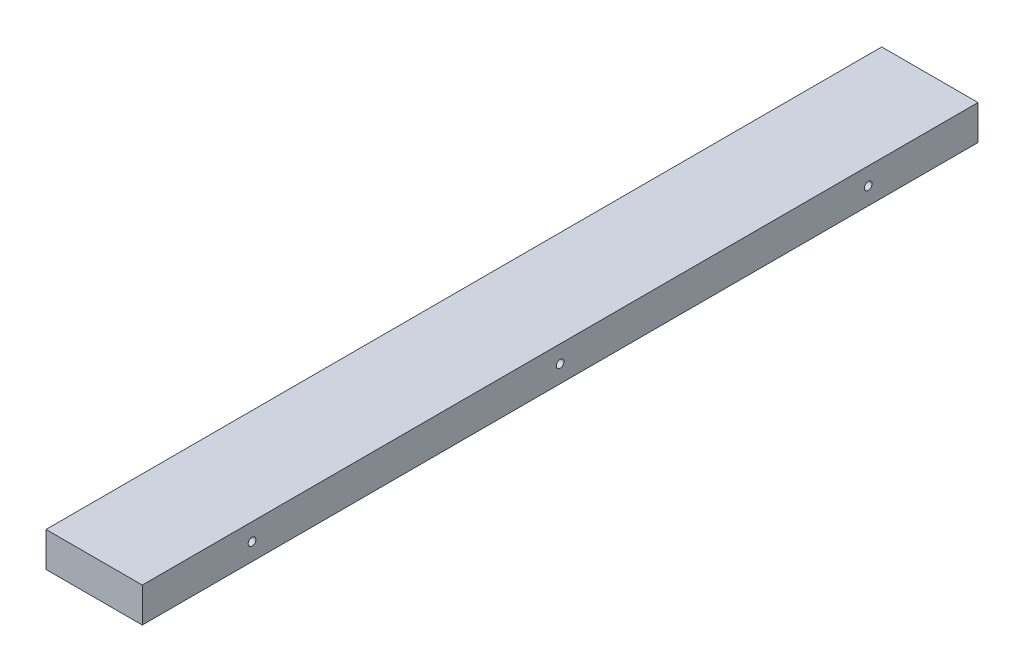
ISO-10303-21;
HEADER;
FILE_DESCRIPTION(('STEP AP214'),'2;1');
FILE_NAME('part.step','',(''),(''),'','','');
FILE_SCHEMA(('AUTOMOTIVE_DESIGN { 1 0 10303 214 1 1 1 1 }'));
ENDSEC;
DATA;
#1=APPLICATION_CONTEXT('core data for automotive mechanical design processes');
#2=APPLICATION_PROTOCOL_DEFINITION('international standard','automotive_design',2000,#1);
#3=PRODUCT_CONTEXT('',#1,'mechanical');
#4=PRODUCT('Part','Part','',(#3));
#5=PRODUCT_RELATED_PRODUCT_CATEGORY('part','',(#4));
#6=PRODUCT_DEFINITION_FORMATION('','',#4);
#7=PRODUCT_DEFINITION_CONTEXT('part definition',#1,'design');
#8=PRODUCT_DEFINITION('design','',#6,#7);
#9=PRODUCT_DEFINITION_SHAPE('','',#8);
#10=(LENGTH_UNIT() NAMED_UNIT(*) SI_UNIT(.MILLI.,.METRE.));
#11=(NAMED_UNIT(*) PLANE_ANGLE_UNIT() SI_UNIT($,.RADIAN.));
#12=(NAMED_UNIT(*) SI_UNIT($,.STERADIAN.) SOLID_ANGLE_UNIT());
#13=UNCERTAINTY_MEASURE_WITH_UNIT(LENGTH_MEASURE(1.E-05),#10,'distance_accuracy_value','');
#14=(GEOMETRIC_REPRESENTATION_CONTEXT(3) GLOBAL_UNCERTAINTY_ASSIGNED_CONTEXT((#13)) GLOBAL_UNIT_ASSIGNED_CONTEXT((#10,
#11,#12)) REPRESENTATION_CONTEXT('',''));
#15=CARTESIAN_POINT('',(0.,0.,0.));
#16=DIRECTION('',(0.,0.,1.));
#17=DIRECTION('',(1.,0.,0.));
#18=AXIS2_PLACEMENT_3D('',#15,#16,#17);
#19=CARTESIAN_POINT('',(25.,18.,-217.));
#20=DIRECTION('',(-1.,0.,0.));
#21=DIRECTION('',(0.,0.,1.));
#22=AXIS2_PLACEMENT_3D('',#19,#20,#21);
#23=PLANE('',#22);
#24=CARTESIAN_POINT('',(25.,9.00000000000002,-160.));
#25=DIRECTION('',(1.,0.,0.));
#26=DIRECTION('',(0.,0.,-1.));
#27=AXIS2_PLACEMENT_3D('',#24,#25,#26);
#28=CIRCLE('',#27,1.99999999999999);
#29=CARTESIAN_POINT('',(25.,9.00000000000002,-162.));
#30=VERTEX_POINT('',#29);
#31=EDGE_CURVE('E135',#30,#30,#28,.T.);
#32=ORIENTED_EDGE('',*,*,#31,.F.);
#33=EDGE_LOOP('',(#32));
#34=FACE_BOUND('',#33,.T.);
#35=CARTESIAN_POINT('',(25.,9.00000000000004,3.71502623850664E-13));
#36=DIRECTION('',(1.,0.,0.));
#37=DIRECTION('',(0.,0.,-1.));
#38=AXIS2_PLACEMENT_3D('',#35,#36,#37);
#39=CIRCLE('',#38,1.99999999999999);
#40=CARTESIAN_POINT('',(25.,9.00000000000004,-1.99999999999962));
#41=VERTEX_POINT('',#40);
#42=EDGE_CURVE('E141',#41,#41,#39,.T.);
#43=ORIENTED_EDGE('',*,*,#42,.F.);
#44=EDGE_LOOP('',(#43));
#45=FACE_BOUND('',#44,.T.);
#46=CARTESIAN_POINT('',(25.,9.00000000000002,160.));
#47=DIRECTION('',(1.,0.,0.));
#48=DIRECTION('',(0.,0.,-1.));
#49=AXIS2_PLACEMENT_3D('',#46,#47,#48);
#50=CIRCLE('',#49,1.99999999999999);
#51=CARTESIAN_POINT('',(25.,9.00000000000002,158.));
#52=VERTEX_POINT('',#51);
#53=EDGE_CURVE('E147',#52,#52,#50,.T.);
#54=ORIENTED_EDGE('',*,*,#53,.F.);
#55=EDGE_LOOP('',(#54));
#56=FACE_BOUND('',#55,.T.);
#57=DIRECTION('',(0.,0.,-1.));
#58=VECTOR('',#57,1.);
#59=CARTESIAN_POINT('',(25.,0.,-217.));
#60=LINE('',#59,#58);
#61=CARTESIAN_POINT('',(25.,0.,217.));
#62=VERTEX_POINT('',#61);
#63=CARTESIAN_POINT('',(25.,0.,-217.));
#64=VERTEX_POINT('',#63);
#65=EDGE_CURVE('E153',#62,#64,#60,.T.);
#66=ORIENTED_EDGE('',*,*,#65,.T.);
#67=DIRECTION('',(0.,-1.,0.));
#68=VECTOR('',#67,1.);
#69=CARTESIAN_POINT('',(25.,18.,-217.));
#70=LINE('',#69,#68);
#71=CARTESIAN_POINT('',(25.,18.,-217.));
#72=VERTEX_POINT('',#71);
#73=EDGE_CURVE('E11',#72,#64,#70,.T.);
#74=ORIENTED_EDGE('',*,*,#73,.F.);
#75=DIRECTION('',(0.,0.,-1.));
#76=VECTOR('',#75,1.);
#77=CARTESIAN_POINT('',(25.,18.,-217.));
#78=LINE('',#77,#76);
#79=CARTESIAN_POINT('',(25.,18.,217.));
#80=VERTEX_POINT('',#79);
#81=EDGE_CURVE('E154',#80,#72,#78,.T.);
#82=ORIENTED_EDGE('',*,*,#81,.F.);
#83=DIRECTION('',(0.,-1.,0.));
#84=VECTOR('',#83,1.);
#85=CARTESIAN_POINT('',(25.,18.,217.));
#86=LINE('',#85,#84);
#87=EDGE_CURVE('E160',#80,#62,#86,.T.);
#88=ORIENTED_EDGE('',*,*,#87,.T.);
#89=EDGE_LOOP('',(#66,#74,#82,#88));
#90=FACE_BOUND('',#89,.T.);
#91=ADVANCED_FACE('F33',(#34,#45,#56,#90),#23,.F.);
#92=CARTESIAN_POINT('',(-25.,18.,-217.));
#93=DIRECTION('',(0.,0.,1.));
#94=DIRECTION('',(1.,0.,0.));
#95=AXIS2_PLACEMENT_3D('',#92,#93,#94);
#96=PLANE('',#95);
#97=DIRECTION('',(-1.,0.,0.));
#98=VECTOR('',#97,1.);
#99=CARTESIAN_POINT('',(-25.,0.,-217.));
#100=LINE('',#99,#98);
#101=CARTESIAN_POINT('',(-25.,0.,-217.));
#102=VERTEX_POINT('',#101);
#103=EDGE_CURVE('E163',#64,#102,#100,.T.);
#104=ORIENTED_EDGE('',*,*,#103,.T.);
#105=DIRECTION('',(0.,-1.,0.));
#106=VECTOR('',#105,1.);
#107=CARTESIAN_POINT('',(-25.,18.,-217.));
#108=LINE('',#107,#106);
#109=CARTESIAN_POINT('',(-25.,18.,-217.));
#110=VERTEX_POINT('',#109);
#111=EDGE_CURVE('E41',#110,#102,#108,.T.);
#112=ORIENTED_EDGE('',*,*,#111,.F.);
#113=DIRECTION('',(-1.,0.,0.));
#114=VECTOR('',#113,1.);
#115=CARTESIAN_POINT('',(-25.,18.,-217.));
#116=LINE('',#115,#114);
#117=EDGE_CURVE('E80',#72,#110,#116,.T.);
#118=ORIENTED_EDGE('',*,*,#117,.F.);
#119=ORIENTED_EDGE('',*,*,#73,.T.);
#120=EDGE_LOOP('',(#104,#112,#118,#119));
#121=FACE_BOUND('',#120,.T.);
#122=ADVANCED_FACE('F186',(#121),#96,.F.);
#123=CARTESIAN_POINT('',(-25.,18.,-217.));
#124=DIRECTION('',(1.,0.,0.));
#125=DIRECTION('',(0.,0.,-1.));
#126=AXIS2_PLACEMENT_3D('',#123,#124,#125);
#127=PLANE('',#126);
#128=CARTESIAN_POINT('',(-25.,9.,180.));
#129=DIRECTION('',(-1.,0.,0.));
#130=DIRECTION('',(0.,0.,1.));
#131=AXIS2_PLACEMENT_3D('',#128,#129,#130);
#132=CIRCLE('',#131,1.99999999999999);
#133=CARTESIAN_POINT('',(-25.,9.,182.));
#134=VERTEX_POINT('',#133);
#135=EDGE_CURVE('E113',#134,#134,#132,.T.);
#136=ORIENTED_EDGE('',*,*,#135,.F.);
#137=EDGE_LOOP('',(#136));
#138=FACE_BOUND('',#137,.T.);
#139=CARTESIAN_POINT('',(-25.,9.,60.0000000000001));
#140=DIRECTION('',(-1.,0.,0.));
#141=DIRECTION('',(0.,0.,1.));
#142=AXIS2_PLACEMENT_3D('',#139,#140,#141);
#143=CIRCLE('',#142,1.99999999999999);
#144=CARTESIAN_POINT('',(-25.,9.,62.));
#145=VERTEX_POINT('',#144);
#146=EDGE_CURVE('E112',#145,#145,#143,.T.);
#147=ORIENTED_EDGE('',*,*,#146,.F.);
#148=EDGE_LOOP('',(#147));
#149=FACE_BOUND('',#148,.T.);
#150=CARTESIAN_POINT('',(-25.,9.,-59.9999999999999));
#151=DIRECTION('',(-1.,0.,0.));
#152=DIRECTION('',(0.,0.,1.));
#153=AXIS2_PLACEMENT_3D('',#150,#151,#152);
#154=CIRCLE('',#153,1.99999999999999);
#155=CARTESIAN_POINT('',(-25.,9.,-58.));
#156=VERTEX_POINT('',#155);
#157=EDGE_CURVE('E123',#156,#156,#154,.T.);
#158=ORIENTED_EDGE('',*,*,#157,.F.);
#159=EDGE_LOOP('',(#158));
#160=FACE_BOUND('',#159,.T.);
#161=CARTESIAN_POINT('',(-25.,9.,-180.));
#162=DIRECTION('',(-1.,0.,0.));
#163=DIRECTION('',(0.,0.,1.));
#164=AXIS2_PLACEMENT_3D('',#161,#162,#163);
#165=CIRCLE('',#164,1.99999999999999);
#166=CARTESIAN_POINT('',(-25.,9.,-178.));
#167=VERTEX_POINT('',#166);
#168=EDGE_CURVE('E129',#167,#167,#165,.T.);
#169=ORIENTED_EDGE('',*,*,#168,.F.);
#170=EDGE_LOOP('',(#169));
#171=FACE_BOUND('',#170,.T.);
#172=DIRECTION('',(0.,0.,1.));
#173=VECTOR('',#172,1.);
#174=CARTESIAN_POINT('',(-25.,0.,-217.));
#175=LINE('',#174,#173);
#176=CARTESIAN_POINT('',(-25.,0.,217.));
#177=VERTEX_POINT('',#176);
#178=EDGE_CURVE('E67',#102,#177,#175,.T.);
#179=ORIENTED_EDGE('',*,*,#178,.T.);
#180=DIRECTION('',(0.,-1.,0.));
#181=VECTOR('',#180,1.);
#182=CARTESIAN_POINT('',(-25.,18.,217.));
#183=LINE('',#182,#181);
#184=CARTESIAN_POINT('',(-25.,18.,217.));
#185=VERTEX_POINT('',#184);
#186=EDGE_CURVE('E168',#185,#177,#183,.T.);
#187=ORIENTED_EDGE('',*,*,#186,.F.);
#188=DIRECTION('',(0.,0.,1.));
#189=VECTOR('',#188,1.);
#190=CARTESIAN_POINT('',(-25.,18.,-217.));
#191=LINE('',#190,#189);
#192=EDGE_CURVE('E157',#110,#185,#191,.T.);
#193=ORIENTED_EDGE('',*,*,#192,.F.);
#194=ORIENTED_EDGE('',*,*,#111,.T.);
#195=EDGE_LOOP('',(#179,#187,#193,#194));
#196=FACE_BOUND('',#195,.T.);
#197=ADVANCED_FACE('F170',(#138,#149,#160,#171,#196),#127,.F.);
#198=CARTESIAN_POINT('',(-25.,18.,217.));
#199=DIRECTION('',(0.,0.,-1.));
#200=DIRECTION('',(-1.,0.,0.));
#201=AXIS2_PLACEMENT_3D('',#198,#199,#200);
#202=PLANE('',#201);
#203=DIRECTION('',(1.,0.,0.));
#204=VECTOR('',#203,1.);
#205=CARTESIAN_POINT('',(-25.,0.,217.));
#206=LINE('',#205,#204);
#207=EDGE_CURVE('E73',#177,#62,#206,.T.);
#208=ORIENTED_EDGE('',*,*,#207,.T.);
#209=ORIENTED_EDGE('',*,*,#87,.F.);
#210=DIRECTION('',(1.,0.,0.));
#211=VECTOR('',#210,1.);
#212=CARTESIAN_POINT('',(-25.,18.,217.));
#213=LINE('',#212,#211);
#214=EDGE_CURVE('E49',#185,#80,#213,.T.);
#215=ORIENTED_EDGE('',*,*,#214,.F.);
#216=ORIENTED_EDGE('',*,*,#186,.T.);
#217=EDGE_LOOP('',(#208,#209,#215,#216));
#218=FACE_BOUND('',#217,.T.);
#219=ADVANCED_FACE('F177',(#218),#202,.F.);
#220=CARTESIAN_POINT('',(0.,18.,0.));
#221=DIRECTION('',(0.,1.,0.));
#222=DIRECTION('',(0.,0.,1.));
#223=AXIS2_PLACEMENT_3D('',#220,#221,#222);
#224=PLANE('',#223);
#225=ORIENTED_EDGE('',*,*,#81,.T.);
#226=ORIENTED_EDGE('',*,*,#117,.T.);
#227=ORIENTED_EDGE('',*,*,#192,.T.);
#228=ORIENTED_EDGE('',*,*,#214,.T.);
#229=EDGE_LOOP('',(#225,#226,#227,#228));
#230=FACE_BOUND('',#229,.T.);
#231=ADVANCED_FACE('F179',(#230),#224,.T.);
#232=CARTESIAN_POINT('',(0.,0.,0.));
#233=DIRECTION('',(0.,1.,0.));
#234=DIRECTION('',(0.,0.,1.));
#235=AXIS2_PLACEMENT_3D('',#232,#233,#234);
#236=PLANE('',#235);
#237=ORIENTED_EDGE('',*,*,#65,.F.);
#238=ORIENTED_EDGE('',*,*,#207,.F.);
#239=ORIENTED_EDGE('',*,*,#178,.F.);
#240=ORIENTED_EDGE('',*,*,#103,.F.);
#241=EDGE_LOOP('',(#237,#238,#239,#240));
#242=FACE_BOUND('',#241,.T.);
#243=ADVANCED_FACE('F173',(#242),#236,.F.);
#244=CARTESIAN_POINT('',(-4.99999999999998,9.00000000000002,160.));
#245=DIRECTION('',(1.,0.,0.));
#246=DIRECTION('',(0.,0.,-1.));
#247=AXIS2_PLACEMENT_3D('',#244,#245,#246);
#248=CONICAL_SURFACE('',#247,1.99999999999998,1.02974425867665);
#249=CARTESIAN_POINT('',(-6.2017212380551,9.00000000000001,160.));
#250=VERTEX_POINT('',#249);
#251=VERTEX_LOOP('',#250);
#252=FACE_BOUND('',#251,.T.);
#253=CARTESIAN_POINT('',(-4.99999999999998,9.00000000000002,160.));
#254=DIRECTION('',(1.,0.,0.));
#255=DIRECTION('',(0.,0.,-1.));
#256=AXIS2_PLACEMENT_3D('',#253,#254,#255);
#257=CIRCLE('',#256,1.99999999999998);
#258=CARTESIAN_POINT('',(-4.99999999999998,9.00000000000002,158.));
#259=VERTEX_POINT('',#258);
#260=EDGE_CURVE('E150',#259,#259,#257,.T.);
#261=ORIENTED_EDGE('',*,*,#260,.T.);
#262=EDGE_LOOP('',(#261));
#263=FACE_BOUND('',#262,.T.);
#264=ADVANCED_FACE('F204',(#252,#263),#248,.F.);
#265=CARTESIAN_POINT('',(25.,9.00000000000002,160.));
#266=DIRECTION('',(1.,0.,0.));
#267=DIRECTION('',(0.,0.,-1.));
#268=AXIS2_PLACEMENT_3D('',#265,#266,#267);
#269=CYLINDRICAL_SURFACE('',#268,1.99999999999999);
#270=ORIENTED_EDGE('',*,*,#260,.F.);
#271=EDGE_LOOP('',(#270));
#272=FACE_BOUND('',#271,.T.);
#273=ORIENTED_EDGE('',*,*,#53,.T.);
#274=EDGE_LOOP('',(#273));
#275=FACE_BOUND('',#274,.T.);
#276=ADVANCED_FACE('F201',(#272,#275),#269,.F.);
#277=CARTESIAN_POINT('',(-5.,9.00000000000004,3.75339800203056E-13));
#278=DIRECTION('',(1.,0.,0.));
#279=DIRECTION('',(0.,0.,-1.));
#280=AXIS2_PLACEMENT_3D('',#277,#278,#279);
#281=CONICAL_SURFACE('',#280,1.99999999999998,1.02974425867665);
#282=CARTESIAN_POINT('',(-6.20172123805512,9.00000000000003,3.75493507413617E-13));
#283=VERTEX_POINT('',#282);
#284=VERTEX_LOOP('',#283);
#285=FACE_BOUND('',#284,.T.);
#286=CARTESIAN_POINT('',(-5.,9.00000000000004,3.75339800203056E-13));
#287=DIRECTION('',(1.,0.,0.));
#288=DIRECTION('',(0.,0.,-1.));
#289=AXIS2_PLACEMENT_3D('',#286,#287,#288);
#290=CIRCLE('',#289,1.99999999999998);
#291=CARTESIAN_POINT('',(-5.,9.00000000000004,-1.99999999999961));
#292=VERTEX_POINT('',#291);
#293=EDGE_CURVE('E144',#292,#292,#290,.T.);
#294=ORIENTED_EDGE('',*,*,#293,.T.);
#295=EDGE_LOOP('',(#294));
#296=FACE_BOUND('',#295,.T.);
#297=ADVANCED_FACE('F203',(#285,#296),#281,.F.);
#298=CARTESIAN_POINT('',(25.,9.00000000000004,3.71502623850664E-13));
#299=DIRECTION('',(1.,0.,0.));
#300=DIRECTION('',(0.,0.,-1.));
#301=AXIS2_PLACEMENT_3D('',#298,#299,#300);
#302=CYLINDRICAL_SURFACE('',#301,1.99999999999999);
#303=ORIENTED_EDGE('',*,*,#293,.F.);
#304=EDGE_LOOP('',(#303));
#305=FACE_BOUND('',#304,.T.);
#306=ORIENTED_EDGE('',*,*,#42,.T.);
#307=EDGE_LOOP('',(#306));
#308=FACE_BOUND('',#307,.T.);
#309=ADVANCED_FACE('F211',(#305,#308),#302,.F.);
#310=CARTESIAN_POINT('',(-5.00000000000002,9.00000000000002,-160.));
#311=DIRECTION('',(1.,0.,0.));
#312=DIRECTION('',(0.,0.,-1.));
#313=AXIS2_PLACEMENT_3D('',#310,#311,#312);
#314=CONICAL_SURFACE('',#313,1.99999999999998,1.02974425867665);
#315=CARTESIAN_POINT('',(-6.20172123805514,9.00000000000001,-160.));
#316=VERTEX_POINT('',#315);
#317=VERTEX_LOOP('',#316);
#318=FACE_BOUND('',#317,.T.);
#319=CARTESIAN_POINT('',(-5.00000000000002,9.00000000000002,-160.));
#320=DIRECTION('',(1.,0.,0.));
#321=DIRECTION('',(0.,0.,-1.));
#322=AXIS2_PLACEMENT_3D('',#319,#320,#321);
#323=CIRCLE('',#322,1.99999999999998);
#324=CARTESIAN_POINT('',(-5.00000000000002,9.00000000000002,-162.));
#325=VERTEX_POINT('',#324);
#326=EDGE_CURVE('E138',#325,#325,#323,.T.);
#327=ORIENTED_EDGE('',*,*,#326,.T.);
#328=EDGE_LOOP('',(#327));
#329=FACE_BOUND('',#328,.T.);
#330=ADVANCED_FACE('F248',(#318,#329),#314,.F.);
#331=CARTESIAN_POINT('',(25.,9.00000000000002,-160.));
#332=DIRECTION('',(1.,0.,0.));
#333=DIRECTION('',(0.,0.,-1.));
#334=AXIS2_PLACEMENT_3D('',#331,#332,#333);
#335=CYLINDRICAL_SURFACE('',#334,1.99999999999999);
#336=ORIENTED_EDGE('',*,*,#326,.F.);
#337=EDGE_LOOP('',(#336));
#338=FACE_BOUND('',#337,.T.);
#339=ORIENTED_EDGE('',*,*,#31,.T.);
#340=EDGE_LOOP('',(#339));
#341=FACE_BOUND('',#340,.T.);
#342=ADVANCED_FACE('F257',(#338,#341),#335,.F.);
#343=CARTESIAN_POINT('',(4.99999999999997,9.,-180.));
#344=DIRECTION('',(-1.,0.,0.));
#345=DIRECTION('',(0.,0.,1.));
#346=AXIS2_PLACEMENT_3D('',#343,#344,#345);
#347=CONICAL_SURFACE('',#346,1.99999999999999,1.02974425867665);
#348=CARTESIAN_POINT('',(6.2017212380551,9.,-180.));
#349=VERTEX_POINT('',#348);
#350=VERTEX_LOOP('',#349);
#351=FACE_BOUND('',#350,.T.);
#352=CARTESIAN_POINT('',(4.99999999999997,9.,-180.));
#353=DIRECTION('',(-1.,0.,0.));
#354=DIRECTION('',(0.,0.,1.));
#355=AXIS2_PLACEMENT_3D('',#352,#353,#354);
#356=CIRCLE('',#355,1.99999999999999);
#357=CARTESIAN_POINT('',(4.99999999999997,9.,-178.));
#358=VERTEX_POINT('',#357);
#359=EDGE_CURVE('E132',#358,#358,#356,.T.);
#360=ORIENTED_EDGE('',*,*,#359,.T.);
#361=EDGE_LOOP('',(#360));
#362=FACE_BOUND('',#361,.T.);
#363=ADVANCED_FACE('F267',(#351,#362),#347,.F.);
#364=CARTESIAN_POINT('',(-25.,9.,-180.));
#365=DIRECTION('',(-1.,0.,0.));
#366=DIRECTION('',(0.,0.,1.));
#367=AXIS2_PLACEMENT_3D('',#364,#365,#366);
#368=CYLINDRICAL_SURFACE('',#367,1.99999999999999);
#369=ORIENTED_EDGE('',*,*,#359,.F.);
#370=EDGE_LOOP('',(#369));
#371=FACE_BOUND('',#370,.T.);
#372=ORIENTED_EDGE('',*,*,#168,.T.);
#373=EDGE_LOOP('',(#372));
#374=FACE_BOUND('',#373,.T.);
#375=ADVANCED_FACE('F285',(#371,#374),#368,.F.);
#376=CARTESIAN_POINT('',(4.99999999999999,9.,-60.));
#377=DIRECTION('',(-1.,0.,0.));
#378=DIRECTION('',(0.,0.,1.));
#379=AXIS2_PLACEMENT_3D('',#376,#377,#378);
#380=CONICAL_SURFACE('',#379,1.99999999999999,1.02974425867665);
#381=CARTESIAN_POINT('',(6.20172123805511,9.,-60.));
#382=VERTEX_POINT('',#381);
#383=VERTEX_LOOP('',#382);
#384=FACE_BOUND('',#383,.T.);
#385=CARTESIAN_POINT('',(4.99999999999999,9.,-60.));
#386=DIRECTION('',(-1.,0.,0.));
#387=DIRECTION('',(0.,0.,1.));
#388=AXIS2_PLACEMENT_3D('',#385,#386,#387);
#389=CIRCLE('',#388,1.99999999999999);
#390=CARTESIAN_POINT('',(4.99999999999999,9.,-58.));
#391=VERTEX_POINT('',#390);
#392=EDGE_CURVE('E126',#391,#391,#389,.T.);
#393=ORIENTED_EDGE('',*,*,#392,.T.);
#394=EDGE_LOOP('',(#393));
#395=FACE_BOUND('',#394,.T.);
#396=ADVANCED_FACE('F295',(#384,#395),#380,.F.);
#397=CARTESIAN_POINT('',(-25.,9.,-59.9999999999999));
#398=DIRECTION('',(-1.,0.,0.));
#399=DIRECTION('',(0.,0.,1.));
#400=AXIS2_PLACEMENT_3D('',#397,#398,#399);
#401=CYLINDRICAL_SURFACE('',#400,1.99999999999999);
#402=ORIENTED_EDGE('',*,*,#392,.F.);
#403=EDGE_LOOP('',(#402));
#404=FACE_BOUND('',#403,.T.);
#405=ORIENTED_EDGE('',*,*,#157,.T.);
#406=EDGE_LOOP('',(#405));
#407=FACE_BOUND('',#406,.T.);
#408=ADVANCED_FACE('F305',(#404,#407),#401,.F.);
#409=CARTESIAN_POINT('',(5.,9.,60.));
#410=DIRECTION('',(-1.,0.,0.));
#411=DIRECTION('',(0.,0.,1.));
#412=AXIS2_PLACEMENT_3D('',#409,#410,#411);
#413=CONICAL_SURFACE('',#412,1.99999999999999,1.02974425867665);
#414=CARTESIAN_POINT('',(6.20172123805513,9.,60.));
#415=VERTEX_POINT('',#414);
#416=VERTEX_LOOP('',#415);
#417=FACE_BOUND('',#416,.T.);
#418=CARTESIAN_POINT('',(5.,9.,60.));
#419=DIRECTION('',(-1.,0.,0.));
#420=DIRECTION('',(0.,0.,1.));
#421=AXIS2_PLACEMENT_3D('',#418,#419,#420);
#422=CIRCLE('',#421,1.99999999999999);
#423=CARTESIAN_POINT('',(5.,9.,62.));
#424=VERTEX_POINT('',#423);
#425=EDGE_CURVE('E116',#424,#424,#422,.T.);
#426=ORIENTED_EDGE('',*,*,#425,.T.);
#427=EDGE_LOOP('',(#426));
#428=FACE_BOUND('',#427,.T.);
#429=ADVANCED_FACE('F315',(#417,#428),#413,.F.);
#430=CARTESIAN_POINT('',(-25.,9.,60.0000000000001));
#431=DIRECTION('',(-1.,0.,0.));
#432=DIRECTION('',(0.,0.,1.));
#433=AXIS2_PLACEMENT_3D('',#430,#431,#432);
#434=CYLINDRICAL_SURFACE('',#433,1.99999999999999);
#435=ORIENTED_EDGE('',*,*,#425,.F.);
#436=EDGE_LOOP('',(#435));
#437=FACE_BOUND('',#436,.T.);
#438=ORIENTED_EDGE('',*,*,#146,.T.);
#439=EDGE_LOOP('',(#438));
#440=FACE_BOUND('',#439,.T.);
#441=ADVANCED_FACE('F106',(#437,#440),#434,.F.);
#442=CARTESIAN_POINT('',(5.00000000000002,9.,180.));
#443=DIRECTION('',(-1.,0.,0.));
#444=DIRECTION('',(0.,0.,1.));
#445=AXIS2_PLACEMENT_3D('',#442,#443,#444);
#446=CONICAL_SURFACE('',#445,1.99999999999999,1.02974425867665);
#447=CARTESIAN_POINT('',(6.20172123805515,9.,180.));
#448=VERTEX_POINT('',#447);
#449=VERTEX_LOOP('',#448);
#450=FACE_BOUND('',#449,.T.);
#451=CARTESIAN_POINT('',(5.00000000000002,9.,180.));
#452=DIRECTION('',(-1.,0.,0.));
#453=DIRECTION('',(0.,0.,1.));
#454=AXIS2_PLACEMENT_3D('',#451,#452,#453);
#455=CIRCLE('',#454,1.99999999999999);
#456=CARTESIAN_POINT('',(5.00000000000002,9.,182.));
#457=VERTEX_POINT('',#456);
#458=EDGE_CURVE('E110',#457,#457,#455,.T.);
#459=ORIENTED_EDGE('',*,*,#458,.T.);
#460=EDGE_LOOP('',(#459));
#461=FACE_BOUND('',#460,.T.);
#462=ADVANCED_FACE('F102',(#450,#461),#446,.F.);
#463=CARTESIAN_POINT('',(-25.,9.,180.));
#464=DIRECTION('',(-1.,0.,0.));
#465=DIRECTION('',(0.,0.,1.));
#466=AXIS2_PLACEMENT_3D('',#463,#464,#465);
#467=CYLINDRICAL_SURFACE('',#466,1.99999999999999);
#468=ORIENTED_EDGE('',*,*,#458,.F.);
#469=EDGE_LOOP('',(#468));
#470=FACE_BOUND('',#469,.T.);
#471=ORIENTED_EDGE('',*,*,#135,.T.);
#472=EDGE_LOOP('',(#471));
#473=FACE_BOUND('',#472,.T.);
#474=ADVANCED_FACE('F105',(#470,#473),#467,.F.);
#475=CLOSED_SHELL('',(#91,#122,#197,#219,#231,#243,#264,#276,#297,#309,#330,#342,#363,#375,#396,
#408,#429,#441,#462,#474));
#476=MANIFOLD_SOLID_BREP('B2',#475);
#477=ADVANCED_BREP_SHAPE_REPRESENTATION('',(#18,#476),#14);
#478=SHAPE_DEFINITION_REPRESENTATION(#9,#477);
ENDSEC;
END-ISO-10303-21;
